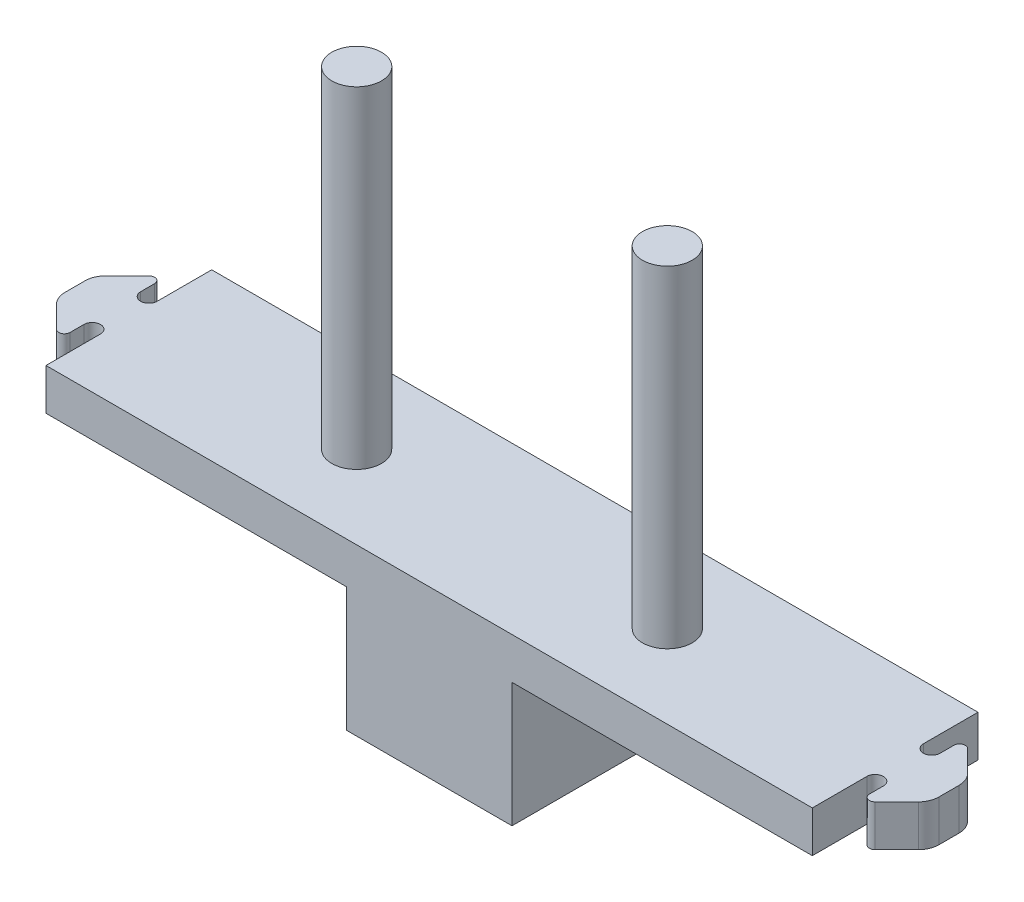
ISO-10303-21;
HEADER;
FILE_DESCRIPTION(('STEP AP214'),'2;1');
FILE_NAME('part.step','',(''),(''),'','','');
FILE_SCHEMA(('AUTOMOTIVE_DESIGN { 1 0 10303 214 1 1 1 1 }'));
ENDSEC;
DATA;
#1=APPLICATION_CONTEXT('core data for automotive mechanical design processes');
#2=APPLICATION_PROTOCOL_DEFINITION('international standard','automotive_design',2000,#1);
#3=PRODUCT_CONTEXT('',#1,'mechanical');
#4=PRODUCT('Part','Part','',(#3));
#5=PRODUCT_RELATED_PRODUCT_CATEGORY('part','',(#4));
#6=PRODUCT_DEFINITION_FORMATION('','',#4);
#7=PRODUCT_DEFINITION_CONTEXT('part definition',#1,'design');
#8=PRODUCT_DEFINITION('design','',#6,#7);
#9=PRODUCT_DEFINITION_SHAPE('','',#8);
#10=(LENGTH_UNIT() NAMED_UNIT(*) SI_UNIT(.MILLI.,.METRE.));
#11=(NAMED_UNIT(*) PLANE_ANGLE_UNIT() SI_UNIT($,.RADIAN.));
#12=(NAMED_UNIT(*) SI_UNIT($,.STERADIAN.) SOLID_ANGLE_UNIT());
#13=UNCERTAINTY_MEASURE_WITH_UNIT(LENGTH_MEASURE(1.E-05),#10,'distance_accuracy_value','');
#14=(GEOMETRIC_REPRESENTATION_CONTEXT(3) GLOBAL_UNCERTAINTY_ASSIGNED_CONTEXT((#13)) GLOBAL_UNIT_ASSIGNED_CONTEXT((#10,
#11,#12)) REPRESENTATION_CONTEXT('',''));
#15=CARTESIAN_POINT('',(0.,0.,0.));
#16=DIRECTION('',(0.,0.,1.));
#17=DIRECTION('',(1.,0.,0.));
#18=AXIS2_PLACEMENT_3D('',#15,#16,#17);
#19=CARTESIAN_POINT('',(0.,0.,0.));
#20=DIRECTION('',(0.,-1.,0.));
#21=DIRECTION('',(0.,0.,-1.));
#22=AXIS2_PLACEMENT_3D('',#19,#20,#21);
#23=PLANE('',#22);
#24=DIRECTION('',(-1.,0.,0.));
#25=VECTOR('',#24,1.);
#26=CARTESIAN_POINT('',(0.,0.,25.4));
#27=LINE('',#26,#25);
#28=CARTESIAN_POINT('',(0.,0.,25.4));
#29=VERTEX_POINT('',#28);
#30=CARTESIAN_POINT('',(-46.0375,0.,25.4));
#31=VERTEX_POINT('',#30);
#32=EDGE_CURVE('E563',#29,#31,#27,.T.);
#33=ORIENTED_EDGE('',*,*,#32,.T.);
#34=DIRECTION('',(0.,0.,-1.));
#35=VECTOR('',#34,1.);
#36=CARTESIAN_POINT('',(-46.0375,0.,25.4));
#37=LINE('',#36,#35);
#38=CARTESIAN_POINT('',(-46.0375,0.,0.));
#39=VERTEX_POINT('',#38);
#40=EDGE_CURVE('E282',#31,#39,#37,.T.);
#41=ORIENTED_EDGE('',*,*,#40,.T.);
#42=DIRECTION('',(-1.,0.,0.));
#43=VECTOR('',#42,1.);
#44=CARTESIAN_POINT('',(0.,0.,0.));
#45=LINE('',#44,#43);
#46=CARTESIAN_POINT('',(0.,0.,0.));
#47=VERTEX_POINT('',#46);
#48=EDGE_CURVE('E267',#47,#39,#45,.T.);
#49=ORIENTED_EDGE('',*,*,#48,.F.);
#50=DIRECTION('',(0.,0.,1.));
#51=VECTOR('',#50,1.);
#52=CARTESIAN_POINT('',(0.,0.,0.));
#53=LINE('',#52,#51);
#54=CARTESIAN_POINT('',(0.,0.,8.35659999999997));
#55=VERTEX_POINT('',#54);
#56=EDGE_CURVE('E558',#47,#55,#53,.T.);
#57=ORIENTED_EDGE('',*,*,#56,.T.);
#58=CARTESIAN_POINT('',(1.27000000000001,0.,8.35659999999997));
#59=DIRECTION('',(0.,-1.,0.));
#60=DIRECTION('',(0.,0.,1.));
#61=AXIS2_PLACEMENT_3D('',#58,#59,#60);
#62=CIRCLE('',#61,1.27000000000001);
#63=CARTESIAN_POINT('',(2.54000000000002,0.,8.35659999999997));
#64=VERTEX_POINT('',#63);
#65=EDGE_CURVE('E424',#64,#55,#62,.T.);
#66=ORIENTED_EDGE('',*,*,#65,.F.);
#67=DIRECTION('',(0.,0.,1.));
#68=VECTOR('',#67,1.);
#69=CARTESIAN_POINT('',(2.54000000000002,0.,8.35659999999997));
#70=LINE('',#69,#68);
#71=CARTESIAN_POINT('',(2.54000000000002,0.,6.22299999999997));
#72=VERTEX_POINT('',#71);
#73=EDGE_CURVE('E420',#72,#64,#70,.T.);
#74=ORIENTED_EDGE('',*,*,#73,.F.);
#75=CARTESIAN_POINT('',(3.40360000000002,0.,6.22299999999998));
#76=DIRECTION('',(0.,1.,0.));
#77=DIRECTION('',(0.,0.,-1.));
#78=AXIS2_PLACEMENT_3D('',#75,#76,#77);
#79=CIRCLE('',#78,0.863600000000003);
#80=CARTESIAN_POINT('',(4.01425741623272,0.,5.61234258376727));
#81=VERTEX_POINT('',#80);
#82=EDGE_CURVE('E416',#81,#72,#79,.T.);
#83=ORIENTED_EDGE('',*,*,#82,.F.);
#84=DIRECTION('',(-0.707106781186547,0.,-0.707106781186547));
#85=VECTOR('',#84,1.);
#86=CARTESIAN_POINT('',(4.01425741623272,0.,5.61234258376727));
#87=LINE('',#86,#85);
#88=CARTESIAN_POINT('',(7.33695218102832,0.,8.93503734856287));
#89=VERTEX_POINT('',#88);
#90=EDGE_CURVE('E412',#89,#81,#87,.T.);
#91=ORIENTED_EDGE('',*,*,#90,.F.);
#92=CARTESIAN_POINT('',(5.07627105699759,0.,11.1643748859159));
#93=DIRECTION('',(0.,1.,0.));
#94=DIRECTION('',(0.,0.,-1.));
#95=AXIS2_PLACEMENT_3D('',#92,#93,#94);
#96=CIRCLE('',#95,3.17500000000002);
#97=CARTESIAN_POINT('',(8.25119370011618,0.,11.1865381486048));
#98=VERTEX_POINT('',#97);
#99=EDGE_CURVE('E407',#98,#89,#96,.T.);
#100=ORIENTED_EDGE('',*,*,#99,.F.);
#101=DIRECTION('',(0.,0.,-1.));
#102=VECTOR('',#101,1.);
#103=CARTESIAN_POINT('',(8.25119370011618,0.,11.1865381486048));
#104=LINE('',#103,#102);
#105=CARTESIAN_POINT('',(8.25119370011618,0.,14.2134618513952));
#106=VERTEX_POINT('',#105);
#107=EDGE_CURVE('E403',#106,#98,#104,.T.);
#108=ORIENTED_EDGE('',*,*,#107,.F.);
#109=CARTESIAN_POINT('',(5.07627105699759,0.,14.2356251140841));
#110=DIRECTION('',(0.,-1.,0.));
#111=DIRECTION('',(0.,0.,1.));
#112=AXIS2_PLACEMENT_3D('',#109,#110,#111);
#113=CIRCLE('',#112,3.17500000000002);
#114=CARTESIAN_POINT('',(7.33695218102832,0.,16.4649626514371));
#115=VERTEX_POINT('',#114);
#116=EDGE_CURVE('E308',#106,#115,#113,.T.);
#117=ORIENTED_EDGE('',*,*,#116,.T.);
#118=DIRECTION('',(-0.707106781186547,0.,0.707106781186547));
#119=VECTOR('',#118,1.);
#120=CARTESIAN_POINT('',(4.01425741623272,0.,19.7876574162327));
#121=LINE('',#120,#119);
#122=CARTESIAN_POINT('',(4.01425741623272,0.,19.7876574162327));
#123=VERTEX_POINT('',#122);
#124=EDGE_CURVE('E305',#115,#123,#121,.T.);
#125=ORIENTED_EDGE('',*,*,#124,.T.);
#126=CARTESIAN_POINT('',(3.40360000000002,0.,19.177));
#127=DIRECTION('',(0.,-1.,0.));
#128=DIRECTION('',(0.,0.,1.));
#129=AXIS2_PLACEMENT_3D('',#126,#127,#128);
#130=CIRCLE('',#129,0.863600000000003);
#131=CARTESIAN_POINT('',(2.54000000000002,0.,19.177));
#132=VERTEX_POINT('',#131);
#133=EDGE_CURVE('E302',#123,#132,#130,.T.);
#134=ORIENTED_EDGE('',*,*,#133,.T.);
#135=DIRECTION('',(0.,0.,-1.));
#136=VECTOR('',#135,1.);
#137=CARTESIAN_POINT('',(2.54000000000002,0.,17.0434));
#138=LINE('',#137,#136);
#139=CARTESIAN_POINT('',(2.54000000000002,0.,17.0434));
#140=VERTEX_POINT('',#139);
#141=EDGE_CURVE('E298',#132,#140,#138,.T.);
#142=ORIENTED_EDGE('',*,*,#141,.T.);
#143=CARTESIAN_POINT('',(1.27000000000001,0.,17.0434));
#144=DIRECTION('',(0.,1.,0.));
#145=DIRECTION('',(0.,0.,-1.));
#146=AXIS2_PLACEMENT_3D('',#143,#144,#145);
#147=CIRCLE('',#146,1.27000000000001);
#148=CARTESIAN_POINT('',(0.,0.,17.0434));
#149=VERTEX_POINT('',#148);
#150=EDGE_CURVE('E294',#140,#149,#147,.T.);
#151=ORIENTED_EDGE('',*,*,#150,.T.);
#152=EDGE_CURVE('E539',#149,#29,#53,.T.);
#153=ORIENTED_EDGE('',*,*,#152,.T.);
#154=EDGE_LOOP('',(#33,#41,#49,#57,#66,#74,#83,#91,#100,#108,#117,#125,#134,#142,#151,#153));
#155=FACE_BOUND('',#154,.T.);
#156=ADVANCED_FACE('F39',(#155),#23,.T.);
#157=CARTESIAN_POINT('',(0.,6.35,0.));
#158=DIRECTION('',(1.,0.,0.));
#159=DIRECTION('',(0.,0.,-1.));
#160=AXIS2_PLACEMENT_3D('',#157,#158,#159);
#161=PLANE('',#160);
#162=ORIENTED_EDGE('',*,*,#152,.F.);
#163=DIRECTION('',(0.,1.,0.));
#164=VECTOR('',#163,1.);
#165=CARTESIAN_POINT('',(0.,0.,17.0434));
#166=LINE('',#165,#164);
#167=CARTESIAN_POINT('',(0.,6.35,17.0434));
#168=VERTEX_POINT('',#167);
#169=EDGE_CURVE('E63',#149,#168,#166,.T.);
#170=ORIENTED_EDGE('',*,*,#169,.T.);
#171=DIRECTION('',(0.,0.,1.));
#172=VECTOR('',#171,1.);
#173=CARTESIAN_POINT('',(0.,6.35,0.));
#174=LINE('',#173,#172);
#175=CARTESIAN_POINT('',(0.,6.35,25.4));
#176=VERTEX_POINT('',#175);
#177=EDGE_CURVE('E545',#168,#176,#174,.T.);
#178=ORIENTED_EDGE('',*,*,#177,.T.);
#179=DIRECTION('',(0.,-1.,0.));
#180=VECTOR('',#179,1.);
#181=CARTESIAN_POINT('',(0.,6.35,25.4));
#182=LINE('',#181,#180);
#183=EDGE_CURVE('E557',#176,#29,#182,.T.);
#184=ORIENTED_EDGE('',*,*,#183,.T.);
#185=EDGE_LOOP('',(#162,#170,#178,#184));
#186=FACE_BOUND('',#185,.T.);
#187=ADVANCED_FACE('F41',(#186),#161,.T.);
#188=CARTESIAN_POINT('',(-117.475,6.35,0.));
#189=DIRECTION('',(1.,0.,0.));
#190=DIRECTION('',(0.,0.,-1.));
#191=AXIS2_PLACEMENT_3D('',#188,#189,#190);
#192=PLANE('',#191);
#193=DIRECTION('',(0.,1.,0.));
#194=VECTOR('',#193,1.);
#195=CARTESIAN_POINT('',(-117.475,0.,17.0434));
#196=LINE('',#195,#194);
#197=CARTESIAN_POINT('',(-117.475,0.,17.0434));
#198=VERTEX_POINT('',#197);
#199=CARTESIAN_POINT('',(-117.475,6.35,17.0434));
#200=VERTEX_POINT('',#199);
#201=EDGE_CURVE('E380',#198,#200,#196,.T.);
#202=ORIENTED_EDGE('',*,*,#201,.F.);
#203=DIRECTION('',(0.,0.,1.));
#204=VECTOR('',#203,1.);
#205=CARTESIAN_POINT('',(-117.475,0.,0.));
#206=LINE('',#205,#204);
#207=CARTESIAN_POINT('',(-117.475,0.,25.4));
#208=VERTEX_POINT('',#207);
#209=EDGE_CURVE('E567',#198,#208,#206,.T.);
#210=ORIENTED_EDGE('',*,*,#209,.T.);
#211=DIRECTION('',(0.,-1.,0.));
#212=VECTOR('',#211,1.);
#213=CARTESIAN_POINT('',(-117.475,6.35,25.4));
#214=LINE('',#213,#212);
#215=CARTESIAN_POINT('',(-117.475,6.35,25.4));
#216=VERTEX_POINT('',#215);
#217=EDGE_CURVE('E581',#216,#208,#214,.T.);
#218=ORIENTED_EDGE('',*,*,#217,.F.);
#219=DIRECTION('',(0.,0.,1.));
#220=VECTOR('',#219,1.);
#221=CARTESIAN_POINT('',(-117.475,6.35,0.));
#222=LINE('',#221,#220);
#223=EDGE_CURVE('E549',#200,#216,#222,.T.);
#224=ORIENTED_EDGE('',*,*,#223,.F.);
#225=EDGE_LOOP('',(#202,#210,#218,#224));
#226=FACE_BOUND('',#225,.T.);
#227=ADVANCED_FACE('F613',(#226),#192,.F.);
#228=CARTESIAN_POINT('',(0.,6.35,0.));
#229=VERTEX_POINT('',#228);
#230=CARTESIAN_POINT('',(0.,6.35,8.35659999999997));
#231=VERTEX_POINT('',#230);
#232=EDGE_CURVE('E540',#229,#231,#174,.T.);
#233=ORIENTED_EDGE('',*,*,#232,.T.);
#234=DIRECTION('',(0.,1.,0.));
#235=VECTOR('',#234,1.);
#236=CARTESIAN_POINT('',(0.,0.,8.35659999999997));
#237=LINE('',#236,#235);
#238=EDGE_CURVE('E450',#55,#231,#237,.T.);
#239=ORIENTED_EDGE('',*,*,#238,.F.);
#240=ORIENTED_EDGE('',*,*,#56,.F.);
#241=DIRECTION('',(0.,-1.,0.));
#242=VECTOR('',#241,1.);
#243=CARTESIAN_POINT('',(0.,6.35,0.));
#244=LINE('',#243,#242);
#245=EDGE_CURVE('E574',#229,#47,#244,.T.);
#246=ORIENTED_EDGE('',*,*,#245,.F.);
#247=EDGE_LOOP('',(#233,#239,#240,#246));
#248=FACE_BOUND('',#247,.T.);
#249=ADVANCED_FACE('F614',(#248),#161,.T.);
#250=DIRECTION('',(0.,1.,0.));
#251=VECTOR('',#250,1.);
#252=CARTESIAN_POINT('',(-117.475,0.,8.35659999999997));
#253=LINE('',#252,#251);
#254=CARTESIAN_POINT('',(-117.475,0.,8.35659999999997));
#255=VERTEX_POINT('',#254);
#256=CARTESIAN_POINT('',(-117.475,6.35,8.35659999999997));
#257=VERTEX_POINT('',#256);
#258=EDGE_CURVE('E492',#255,#257,#253,.T.);
#259=ORIENTED_EDGE('',*,*,#258,.T.);
#260=CARTESIAN_POINT('',(-117.475,6.35,0.));
#261=VERTEX_POINT('',#260);
#262=EDGE_CURVE('E550',#261,#257,#222,.T.);
#263=ORIENTED_EDGE('',*,*,#262,.F.);
#264=DIRECTION('',(0.,-1.,0.));
#265=VECTOR('',#264,1.);
#266=CARTESIAN_POINT('',(-117.475,6.35,0.));
#267=LINE('',#266,#265);
#268=CARTESIAN_POINT('',(-117.475,0.,0.));
#269=VERTEX_POINT('',#268);
#270=EDGE_CURVE('E577',#261,#269,#267,.T.);
#271=ORIENTED_EDGE('',*,*,#270,.T.);
#272=EDGE_CURVE('E568',#269,#255,#206,.T.);
#273=ORIENTED_EDGE('',*,*,#272,.T.);
#274=EDGE_LOOP('',(#259,#263,#271,#273));
#275=FACE_BOUND('',#274,.T.);
#276=ADVANCED_FACE('F618',(#275),#192,.F.);
#277=CARTESIAN_POINT('',(0.,6.35,0.));
#278=DIRECTION('',(0.,0.,1.));
#279=DIRECTION('',(1.,0.,0.));
#280=AXIS2_PLACEMENT_3D('',#277,#278,#279);
#281=PLANE('',#280);
#282=ORIENTED_EDGE('',*,*,#48,.T.);
#283=DIRECTION('',(0.,1.,0.));
#284=VECTOR('',#283,1.);
#285=CARTESIAN_POINT('',(-46.0375,-19.05,0.));
#286=LINE('',#285,#284);
#287=CARTESIAN_POINT('',(-46.0375,-19.05,0.));
#288=VERTEX_POINT('',#287);
#289=EDGE_CURVE('E55',#288,#39,#286,.T.);
#290=ORIENTED_EDGE('',*,*,#289,.F.);
#291=DIRECTION('',(1.,0.,0.));
#292=VECTOR('',#291,1.);
#293=CARTESIAN_POINT('',(-71.4375,-19.05,0.));
#294=LINE('',#293,#292);
#295=CARTESIAN_POINT('',(-71.4375,-19.05,0.));
#296=VERTEX_POINT('',#295);
#297=EDGE_CURVE('E251',#296,#288,#294,.T.);
#298=ORIENTED_EDGE('',*,*,#297,.F.);
#299=DIRECTION('',(0.,1.,0.));
#300=VECTOR('',#299,1.);
#301=CARTESIAN_POINT('',(-71.4375,-19.05,0.));
#302=LINE('',#301,#300);
#303=CARTESIAN_POINT('',(-71.4375,0.,0.));
#304=VERTEX_POINT('',#303);
#305=EDGE_CURVE('E281',#296,#304,#302,.T.);
#306=ORIENTED_EDGE('',*,*,#305,.T.);
#307=EDGE_CURVE('E571',#304,#269,#45,.T.);
#308=ORIENTED_EDGE('',*,*,#307,.T.);
#309=ORIENTED_EDGE('',*,*,#270,.F.);
#310=DIRECTION('',(-1.,0.,0.));
#311=VECTOR('',#310,1.);
#312=CARTESIAN_POINT('',(0.,6.35,0.));
#313=LINE('',#312,#311);
#314=EDGE_CURVE('E554',#229,#261,#313,.T.);
#315=ORIENTED_EDGE('',*,*,#314,.F.);
#316=ORIENTED_EDGE('',*,*,#245,.T.);
#317=EDGE_LOOP('',(#282,#290,#298,#306,#308,#309,#315,#316));
#318=FACE_BOUND('',#317,.T.);
#319=ADVANCED_FACE('F265',(#318),#281,.F.);
#320=CARTESIAN_POINT('',(0.,6.35,25.4));
#321=DIRECTION('',(0.,0.,1.));
#322=DIRECTION('',(1.,0.,0.));
#323=AXIS2_PLACEMENT_3D('',#320,#321,#322);
#324=PLANE('',#323);
#325=ORIENTED_EDGE('',*,*,#32,.F.);
#326=ORIENTED_EDGE('',*,*,#183,.F.);
#327=DIRECTION('',(-1.,0.,0.));
#328=VECTOR('',#327,1.);
#329=CARTESIAN_POINT('',(0.,6.35,25.4));
#330=LINE('',#329,#328);
#331=EDGE_CURVE('E544',#176,#216,#330,.T.);
#332=ORIENTED_EDGE('',*,*,#331,.T.);
#333=ORIENTED_EDGE('',*,*,#217,.T.);
#334=CARTESIAN_POINT('',(-71.4375,0.,25.4));
#335=VERTEX_POINT('',#334);
#336=EDGE_CURVE('E562',#335,#208,#27,.T.);
#337=ORIENTED_EDGE('',*,*,#336,.F.);
#338=DIRECTION('',(0.,1.,0.));
#339=VECTOR('',#338,1.);
#340=CARTESIAN_POINT('',(-71.4375,-19.05,25.4));
#341=LINE('',#340,#339);
#342=CARTESIAN_POINT('',(-71.4375,-19.05,25.4));
#343=VERTEX_POINT('',#342);
#344=EDGE_CURVE('E289',#343,#335,#341,.T.);
#345=ORIENTED_EDGE('',*,*,#344,.F.);
#346=DIRECTION('',(1.,0.,0.));
#347=VECTOR('',#346,1.);
#348=CARTESIAN_POINT('',(-71.4375,-19.05,25.4));
#349=LINE('',#348,#347);
#350=CARTESIAN_POINT('',(-46.0375,-19.05,25.4));
#351=VERTEX_POINT('',#350);
#352=EDGE_CURVE('E274',#343,#351,#349,.T.);
#353=ORIENTED_EDGE('',*,*,#352,.T.);
#354=DIRECTION('',(0.,1.,0.));
#355=VECTOR('',#354,1.);
#356=CARTESIAN_POINT('',(-46.0375,-19.05,25.4));
#357=LINE('',#356,#355);
#358=EDGE_CURVE('E270',#351,#31,#357,.T.);
#359=ORIENTED_EDGE('',*,*,#358,.T.);
#360=EDGE_LOOP('',(#325,#326,#332,#333,#337,#345,#353,#359));
#361=FACE_BOUND('',#360,.T.);
#362=ADVANCED_FACE('F596',(#361),#324,.T.);
#363=CARTESIAN_POINT('',(0.,6.35,0.));
#364=DIRECTION('',(0.,-1.,0.));
#365=DIRECTION('',(0.,0.,-1.));
#366=AXIS2_PLACEMENT_3D('',#363,#364,#365);
#367=PLANE('',#366);
#368=ORIENTED_EDGE('',*,*,#177,.F.);
#369=CARTESIAN_POINT('',(1.27000000000001,6.35,17.0434));
#370=DIRECTION('',(0.,1.,0.));
#371=DIRECTION('',(0.,0.,-1.));
#372=AXIS2_PLACEMENT_3D('',#369,#370,#371);
#373=CIRCLE('',#372,1.27000000000001);
#374=CARTESIAN_POINT('',(2.54000000000002,6.35,17.0434));
#375=VERTEX_POINT('',#374);
#376=EDGE_CURVE('E269',#375,#168,#373,.T.);
#377=ORIENTED_EDGE('',*,*,#376,.F.);
#378=DIRECTION('',(0.,0.,-1.));
#379=VECTOR('',#378,1.);
#380=CARTESIAN_POINT('',(2.54000000000002,6.35,17.0434));
#381=LINE('',#380,#379);
#382=CARTESIAN_POINT('',(2.54000000000002,6.35,19.177));
#383=VERTEX_POINT('',#382);
#384=EDGE_CURVE('E314',#383,#375,#381,.T.);
#385=ORIENTED_EDGE('',*,*,#384,.F.);
#386=CARTESIAN_POINT('',(3.40360000000002,6.35,19.177));
#387=DIRECTION('',(0.,-1.,0.));
#388=DIRECTION('',(0.,0.,1.));
#389=AXIS2_PLACEMENT_3D('',#386,#387,#388);
#390=CIRCLE('',#389,0.863600000000003);
#391=CARTESIAN_POINT('',(4.01425741623272,6.35,19.7876574162327));
#392=VERTEX_POINT('',#391);
#393=EDGE_CURVE('E317',#392,#383,#390,.T.);
#394=ORIENTED_EDGE('',*,*,#393,.F.);
#395=DIRECTION('',(-0.707106781186547,0.,0.707106781186547));
#396=VECTOR('',#395,1.);
#397=CARTESIAN_POINT('',(4.01425741623272,6.35,19.7876574162327));
#398=LINE('',#397,#396);
#399=CARTESIAN_POINT('',(7.33695218102832,6.35,16.4649626514371));
#400=VERTEX_POINT('',#399);
#401=EDGE_CURVE('E320',#400,#392,#398,.T.);
#402=ORIENTED_EDGE('',*,*,#401,.F.);
#403=CARTESIAN_POINT('',(5.07627105699759,6.35,14.2356251140841));
#404=DIRECTION('',(0.,-1.,0.));
#405=DIRECTION('',(0.,0.,1.));
#406=AXIS2_PLACEMENT_3D('',#403,#404,#405);
#407=CIRCLE('',#406,3.17500000000002);
#408=CARTESIAN_POINT('',(8.25119370011618,6.35,14.2134618513952));
#409=VERTEX_POINT('',#408);
#410=EDGE_CURVE('E299',#409,#400,#407,.T.);
#411=ORIENTED_EDGE('',*,*,#410,.F.);
#412=DIRECTION('',(0.,0.,-1.));
#413=VECTOR('',#412,1.);
#414=CARTESIAN_POINT('',(8.25119370011618,6.35,11.1865381486048));
#415=LINE('',#414,#413);
#416=CARTESIAN_POINT('',(8.25119370011618,6.35,11.1865381486048));
#417=VERTEX_POINT('',#416);
#418=EDGE_CURVE('E383',#409,#417,#415,.T.);
#419=ORIENTED_EDGE('',*,*,#418,.T.);
#420=CARTESIAN_POINT('',(5.07627105699759,6.35,11.1643748859159));
#421=DIRECTION('',(0.,1.,0.));
#422=DIRECTION('',(0.,0.,-1.));
#423=AXIS2_PLACEMENT_3D('',#420,#421,#422);
#424=CIRCLE('',#423,3.17500000000002);
#425=CARTESIAN_POINT('',(7.33695218102832,6.35,8.93503734856287));
#426=VERTEX_POINT('',#425);
#427=EDGE_CURVE('E431',#417,#426,#424,.T.);
#428=ORIENTED_EDGE('',*,*,#427,.T.);
#429=DIRECTION('',(-0.707106781186547,0.,-0.707106781186547));
#430=VECTOR('',#429,1.);
#431=CARTESIAN_POINT('',(4.01425741623272,6.35,5.61234258376727));
#432=LINE('',#431,#430);
#433=CARTESIAN_POINT('',(4.01425741623272,6.35,5.61234258376727));
#434=VERTEX_POINT('',#433);
#435=EDGE_CURVE('E435',#426,#434,#432,.T.);
#436=ORIENTED_EDGE('',*,*,#435,.T.);
#437=CARTESIAN_POINT('',(3.40360000000002,6.35,6.22299999999998));
#438=DIRECTION('',(0.,1.,0.));
#439=DIRECTION('',(0.,0.,-1.));
#440=AXIS2_PLACEMENT_3D('',#437,#438,#439);
#441=CIRCLE('',#440,0.863600000000003);
#442=CARTESIAN_POINT('',(2.54000000000002,6.35,6.22299999999997));
#443=VERTEX_POINT('',#442);
#444=EDGE_CURVE('E439',#434,#443,#441,.T.);
#445=ORIENTED_EDGE('',*,*,#444,.T.);
#446=DIRECTION('',(0.,0.,1.));
#447=VECTOR('',#446,1.);
#448=CARTESIAN_POINT('',(2.54000000000002,6.35,8.35659999999997));
#449=LINE('',#448,#447);
#450=CARTESIAN_POINT('',(2.54000000000002,6.35,8.35659999999997));
#451=VERTEX_POINT('',#450);
#452=EDGE_CURVE('E443',#443,#451,#449,.T.);
#453=ORIENTED_EDGE('',*,*,#452,.T.);
#454=CARTESIAN_POINT('',(1.27000000000001,6.35,8.35659999999997));
#455=DIRECTION('',(0.,-1.,0.));
#456=DIRECTION('',(0.,0.,1.));
#457=AXIS2_PLACEMENT_3D('',#454,#455,#456);
#458=CIRCLE('',#457,1.27000000000001);
#459=EDGE_CURVE('E408',#451,#231,#458,.T.);
#460=ORIENTED_EDGE('',*,*,#459,.T.);
#461=ORIENTED_EDGE('',*,*,#232,.F.);
#462=ORIENTED_EDGE('',*,*,#314,.T.);
#463=ORIENTED_EDGE('',*,*,#262,.T.);
#464=CARTESIAN_POINT('',(-118.745,6.35,8.35659999999997));
#465=DIRECTION('',(0.,-1.,0.));
#466=DIRECTION('',(0.,0.,-1.));
#467=AXIS2_PLACEMENT_3D('',#464,#465,#466);
#468=CIRCLE('',#467,1.27000000000001);
#469=CARTESIAN_POINT('',(-120.015,6.35,8.35659999999997));
#470=VERTEX_POINT('',#469);
#471=EDGE_CURVE('E453',#257,#470,#468,.T.);
#472=ORIENTED_EDGE('',*,*,#471,.T.);
#473=DIRECTION('',(0.,0.,-1.));
#474=VECTOR('',#473,1.);
#475=CARTESIAN_POINT('',(-120.015,6.35,8.35659999999997));
#476=LINE('',#475,#474);
#477=CARTESIAN_POINT('',(-120.015,6.35,6.22299999999997));
#478=VERTEX_POINT('',#477);
#479=EDGE_CURVE('E496',#470,#478,#476,.T.);
#480=ORIENTED_EDGE('',*,*,#479,.T.);
#481=CARTESIAN_POINT('',(-120.8786,6.35,6.22299999999998));
#482=DIRECTION('',(0.,1.,0.));
#483=DIRECTION('',(0.,0.,1.));
#484=AXIS2_PLACEMENT_3D('',#481,#482,#483);
#485=CIRCLE('',#484,0.863600000000003);
#486=CARTESIAN_POINT('',(-121.489257416233,6.35,5.61234258376727));
#487=VERTEX_POINT('',#486);
#488=EDGE_CURVE('E500',#478,#487,#485,.T.);
#489=ORIENTED_EDGE('',*,*,#488,.T.);
#490=DIRECTION('',(-0.707106781186547,0.,0.707106781186548));
#491=VECTOR('',#490,1.);
#492=CARTESIAN_POINT('',(-121.489257416233,6.35,5.61234258376727));
#493=LINE('',#492,#491);
#494=CARTESIAN_POINT('',(-124.811952181028,6.35,8.93503734856287));
#495=VERTEX_POINT('',#494);
#496=EDGE_CURVE('E504',#487,#495,#493,.T.);
#497=ORIENTED_EDGE('',*,*,#496,.T.);
#498=CARTESIAN_POINT('',(-122.551271056998,6.35,11.1643748859159));
#499=DIRECTION('',(0.,1.,0.));
#500=DIRECTION('',(0.,0.,1.));
#501=AXIS2_PLACEMENT_3D('',#498,#499,#500);
#502=CIRCLE('',#501,3.17500000000002);
#503=CARTESIAN_POINT('',(-125.726193700116,6.35,11.1865381486048));
#504=VERTEX_POINT('',#503);
#505=EDGE_CURVE('E508',#495,#504,#502,.T.);
#506=ORIENTED_EDGE('',*,*,#505,.T.);
#507=DIRECTION('',(0.,0.,1.));
#508=VECTOR('',#507,1.);
#509=CARTESIAN_POINT('',(-125.726193700116,6.35,11.1865381486048));
#510=LINE('',#509,#508);
#511=CARTESIAN_POINT('',(-125.726193700116,6.35,14.2134618513952));
#512=VERTEX_POINT('',#511);
#513=EDGE_CURVE('E473',#504,#512,#510,.T.);
#514=ORIENTED_EDGE('',*,*,#513,.T.);
#515=CARTESIAN_POINT('',(-122.551271056998,6.35,14.2356251140841));
#516=DIRECTION('',(0.,-1.,0.));
#517=DIRECTION('',(0.,0.,-1.));
#518=AXIS2_PLACEMENT_3D('',#515,#516,#517);
#519=CIRCLE('',#518,3.17500000000002);
#520=CARTESIAN_POINT('',(-124.811952181028,6.35,16.4649626514371));
#521=VERTEX_POINT('',#520);
#522=EDGE_CURVE('E329',#521,#512,#519,.T.);
#523=ORIENTED_EDGE('',*,*,#522,.F.);
#524=DIRECTION('',(-0.707106781186547,0.,-0.707106781186548));
#525=VECTOR('',#524,1.);
#526=CARTESIAN_POINT('',(-121.489257416233,6.35,19.7876574162327));
#527=LINE('',#526,#525);
#528=CARTESIAN_POINT('',(-121.489257416233,6.35,19.7876574162327));
#529=VERTEX_POINT('',#528);
#530=EDGE_CURVE('E369',#529,#521,#527,.T.);
#531=ORIENTED_EDGE('',*,*,#530,.F.);
#532=CARTESIAN_POINT('',(-120.8786,6.35,19.177));
#533=DIRECTION('',(0.,-1.,0.));
#534=DIRECTION('',(0.,0.,-1.));
#535=AXIS2_PLACEMENT_3D('',#532,#533,#534);
#536=CIRCLE('',#535,0.863600000000003);
#537=CARTESIAN_POINT('',(-120.015,6.35,19.177));
#538=VERTEX_POINT('',#537);
#539=EDGE_CURVE('E372',#538,#529,#536,.T.);
#540=ORIENTED_EDGE('',*,*,#539,.F.);
#541=DIRECTION('',(0.,0.,1.));
#542=VECTOR('',#541,1.);
#543=CARTESIAN_POINT('',(-120.015,6.35,17.0434));
#544=LINE('',#543,#542);
#545=CARTESIAN_POINT('',(-120.015,6.35,17.0434));
#546=VERTEX_POINT('',#545);
#547=EDGE_CURVE('E375',#546,#538,#544,.T.);
#548=ORIENTED_EDGE('',*,*,#547,.F.);
#549=CARTESIAN_POINT('',(-118.745,6.35,17.0434));
#550=DIRECTION('',(0.,1.,0.));
#551=DIRECTION('',(0.,0.,1.));
#552=AXIS2_PLACEMENT_3D('',#549,#550,#551);
#553=CIRCLE('',#552,1.27000000000001);
#554=EDGE_CURVE('E353',#200,#546,#553,.T.);
#555=ORIENTED_EDGE('',*,*,#554,.F.);
#556=ORIENTED_EDGE('',*,*,#223,.T.);
#557=ORIENTED_EDGE('',*,*,#331,.F.);
#558=EDGE_LOOP('',(#368,#377,#385,#394,#402,#411,#419,#428,#436,#445,#453,#460,#461,#462,#463,
#472,#480,#489,#497,#506,#514,#523,#531,#540,#548,#555,#556,#557));
#559=FACE_BOUND('',#558,.T.);
#560=CARTESIAN_POINT('',(-82.55,6.35,12.7));
#561=DIRECTION('',(0.,-1.,0.));
#562=DIRECTION('',(0.,0.,-1.));
#563=AXIS2_PLACEMENT_3D('',#560,#561,#562);
#564=CIRCLE('',#563,3.81);
#565=CARTESIAN_POINT('',(-82.55,6.35,8.89));
#566=VERTEX_POINT('',#565);
#567=EDGE_CURVE('E11',#566,#566,#564,.F.);
#568=ORIENTED_EDGE('',*,*,#567,.F.);
#569=EDGE_LOOP('',(#568));
#570=FACE_BOUND('',#569,.T.);
#571=CARTESIAN_POINT('',(-34.925,6.35,12.7));
#572=DIRECTION('',(0.,-1.,0.));
#573=DIRECTION('',(0.,0.,-1.));
#574=AXIS2_PLACEMENT_3D('',#571,#572,#573);
#575=CIRCLE('',#574,3.81);
#576=CARTESIAN_POINT('',(-34.925,6.35,8.89));
#577=VERTEX_POINT('',#576);
#578=EDGE_CURVE('E48',#577,#577,#575,.F.);
#579=ORIENTED_EDGE('',*,*,#578,.F.);
#580=EDGE_LOOP('',(#579));
#581=FACE_BOUND('',#580,.T.);
#582=ADVANCED_FACE('F593',(#559,#570,#581),#367,.F.);
#583=DIRECTION('',(0.,0.,-1.));
#584=VECTOR('',#583,1.);
#585=CARTESIAN_POINT('',(-71.4375,0.,25.4));
#586=LINE('',#585,#584);
#587=EDGE_CURVE('E262',#335,#304,#586,.T.);
#588=ORIENTED_EDGE('',*,*,#587,.F.);
#589=ORIENTED_EDGE('',*,*,#336,.T.);
#590=ORIENTED_EDGE('',*,*,#209,.F.);
#591=CARTESIAN_POINT('',(-118.745,0.,17.0434));
#592=DIRECTION('',(0.,1.,0.));
#593=DIRECTION('',(0.,0.,1.));
#594=AXIS2_PLACEMENT_3D('',#591,#592,#593);
#595=CIRCLE('',#594,1.27000000000001);
#596=CARTESIAN_POINT('',(-120.015,0.,17.0434));
#597=VERTEX_POINT('',#596);
#598=EDGE_CURVE('E362',#198,#597,#595,.T.);
#599=ORIENTED_EDGE('',*,*,#598,.T.);
#600=DIRECTION('',(0.,0.,1.));
#601=VECTOR('',#600,1.);
#602=CARTESIAN_POINT('',(-120.015,0.,17.0434));
#603=LINE('',#602,#601);
#604=CARTESIAN_POINT('',(-120.015,0.,19.177));
#605=VERTEX_POINT('',#604);
#606=EDGE_CURVE('E359',#597,#605,#603,.T.);
#607=ORIENTED_EDGE('',*,*,#606,.T.);
#608=CARTESIAN_POINT('',(-120.8786,0.,19.177));
#609=DIRECTION('',(0.,-1.,0.));
#610=DIRECTION('',(0.,0.,-1.));
#611=AXIS2_PLACEMENT_3D('',#608,#609,#610);
#612=CIRCLE('',#611,0.863600000000003);
#613=CARTESIAN_POINT('',(-121.489257416233,0.,19.7876574162327));
#614=VERTEX_POINT('',#613);
#615=EDGE_CURVE('E356',#605,#614,#612,.T.);
#616=ORIENTED_EDGE('',*,*,#615,.T.);
#617=DIRECTION('',(-0.707106781186547,0.,-0.707106781186548));
#618=VECTOR('',#617,1.);
#619=CARTESIAN_POINT('',(-121.489257416233,0.,19.7876574162327));
#620=LINE('',#619,#618);
#621=CARTESIAN_POINT('',(-124.811952181028,0.,16.4649626514371));
#622=VERTEX_POINT('',#621);
#623=EDGE_CURVE('E352',#614,#622,#620,.T.);
#624=ORIENTED_EDGE('',*,*,#623,.T.);
#625=CARTESIAN_POINT('',(-122.551271056998,0.,14.2356251140841));
#626=DIRECTION('',(0.,-1.,0.));
#627=DIRECTION('',(0.,0.,-1.));
#628=AXIS2_PLACEMENT_3D('',#625,#626,#627);
#629=CIRCLE('',#628,3.17500000000002);
#630=CARTESIAN_POINT('',(-125.726193700116,0.,14.2134618513952));
#631=VERTEX_POINT('',#630);
#632=EDGE_CURVE('E348',#622,#631,#629,.T.);
#633=ORIENTED_EDGE('',*,*,#632,.T.);
#634=DIRECTION('',(0.,0.,1.));
#635=VECTOR('',#634,1.);
#636=CARTESIAN_POINT('',(-125.726193700116,0.,11.1865381486048));
#637=LINE('',#636,#635);
#638=CARTESIAN_POINT('',(-125.726193700116,0.,11.1865381486048));
#639=VERTEX_POINT('',#638);
#640=EDGE_CURVE('E489',#639,#631,#637,.T.);
#641=ORIENTED_EDGE('',*,*,#640,.F.);
#642=CARTESIAN_POINT('',(-122.551271056998,0.,11.1643748859159));
#643=DIRECTION('',(0.,1.,0.));
#644=DIRECTION('',(0.,0.,1.));
#645=AXIS2_PLACEMENT_3D('',#642,#643,#644);
#646=CIRCLE('',#645,3.17500000000002);
#647=CARTESIAN_POINT('',(-124.811952181028,0.,8.93503734856287));
#648=VERTEX_POINT('',#647);
#649=EDGE_CURVE('E485',#648,#639,#646,.T.);
#650=ORIENTED_EDGE('',*,*,#649,.F.);
#651=DIRECTION('',(-0.707106781186547,0.,0.707106781186548));
#652=VECTOR('',#651,1.);
#653=CARTESIAN_POINT('',(-121.489257416233,0.,5.61234258376727));
#654=LINE('',#653,#652);
#655=CARTESIAN_POINT('',(-121.489257416233,0.,5.61234258376727));
#656=VERTEX_POINT('',#655);
#657=EDGE_CURVE('E481',#656,#648,#654,.T.);
#658=ORIENTED_EDGE('',*,*,#657,.F.);
#659=CARTESIAN_POINT('',(-120.8786,0.,6.22299999999998));
#660=DIRECTION('',(0.,1.,0.));
#661=DIRECTION('',(0.,0.,1.));
#662=AXIS2_PLACEMENT_3D('',#659,#660,#661);
#663=CIRCLE('',#662,0.863600000000003);
#664=CARTESIAN_POINT('',(-120.015,0.,6.22299999999997));
#665=VERTEX_POINT('',#664);
#666=EDGE_CURVE('E477',#665,#656,#663,.T.);
#667=ORIENTED_EDGE('',*,*,#666,.F.);
#668=DIRECTION('',(0.,0.,-1.));
#669=VECTOR('',#668,1.);
#670=CARTESIAN_POINT('',(-120.015,0.,8.35659999999997));
#671=LINE('',#670,#669);
#672=CARTESIAN_POINT('',(-120.015,0.,8.35659999999997));
#673=VERTEX_POINT('',#672);
#674=EDGE_CURVE('E472',#673,#665,#671,.T.);
#675=ORIENTED_EDGE('',*,*,#674,.F.);
#676=CARTESIAN_POINT('',(-118.745,0.,8.35659999999997));
#677=DIRECTION('',(0.,-1.,0.));
#678=DIRECTION('',(0.,0.,-1.));
#679=AXIS2_PLACEMENT_3D('',#676,#677,#678);
#680=CIRCLE('',#679,1.27000000000001);
#681=EDGE_CURVE('E468',#255,#673,#680,.T.);
#682=ORIENTED_EDGE('',*,*,#681,.F.);
#683=ORIENTED_EDGE('',*,*,#272,.F.);
#684=ORIENTED_EDGE('',*,*,#307,.F.);
#685=EDGE_LOOP('',(#588,#589,#590,#599,#607,#616,#624,#633,#641,#650,#658,#667,#675,#682,#683,#684));
#686=FACE_BOUND('',#685,.T.);
#687=ADVANCED_FACE('F595',(#686),#23,.T.);
#688=CARTESIAN_POINT('',(-34.925,57.15,12.7));
#689=DIRECTION('',(0.,-1.,0.));
#690=DIRECTION('',(0.,0.,-1.));
#691=AXIS2_PLACEMENT_3D('',#688,#689,#690);
#692=CYLINDRICAL_SURFACE('',#691,3.81);
#693=CARTESIAN_POINT('',(-34.925,57.15,12.7));
#694=DIRECTION('',(0.,1.,0.));
#695=DIRECTION('',(0.,0.,1.));
#696=AXIS2_PLACEMENT_3D('',#693,#694,#695);
#697=CIRCLE('',#696,3.81);
#698=CARTESIAN_POINT('',(-34.925,57.15,16.51));
#699=VERTEX_POINT('',#698);
#700=EDGE_CURVE('E535',#699,#699,#697,.T.);
#701=ORIENTED_EDGE('',*,*,#700,.F.);
#702=EDGE_LOOP('',(#701));
#703=FACE_BOUND('',#702,.T.);
#704=ORIENTED_EDGE('',*,*,#578,.T.);
#705=EDGE_LOOP('',(#704));
#706=FACE_BOUND('',#705,.T.);
#707=ADVANCED_FACE('F591',(#703,#706),#692,.T.);
#708=CARTESIAN_POINT('',(-34.925,57.15,12.7));
#709=DIRECTION('',(0.,1.,0.));
#710=DIRECTION('',(0.,0.,1.));
#711=AXIS2_PLACEMENT_3D('',#708,#709,#710);
#712=PLANE('',#711);
#713=ORIENTED_EDGE('',*,*,#700,.T.);
#714=EDGE_LOOP('',(#713));
#715=FACE_BOUND('',#714,.T.);
#716=ADVANCED_FACE('F794',(#715),#712,.T.);
#717=CARTESIAN_POINT('',(-82.55,57.15,12.7));
#718=DIRECTION('',(0.,-1.,0.));
#719=DIRECTION('',(0.,0.,-1.));
#720=AXIS2_PLACEMENT_3D('',#717,#718,#719);
#721=CYLINDRICAL_SURFACE('',#720,3.81);
#722=CARTESIAN_POINT('',(-82.55,57.15,12.7));
#723=DIRECTION('',(0.,1.,0.));
#724=DIRECTION('',(0.,0.,1.));
#725=AXIS2_PLACEMENT_3D('',#722,#723,#724);
#726=CIRCLE('',#725,3.81);
#727=CARTESIAN_POINT('',(-82.55,57.15,16.51));
#728=VERTEX_POINT('',#727);
#729=EDGE_CURVE('E517',#728,#728,#726,.T.);
#730=ORIENTED_EDGE('',*,*,#729,.F.);
#731=EDGE_LOOP('',(#730));
#732=FACE_BOUND('',#731,.T.);
#733=ORIENTED_EDGE('',*,*,#567,.T.);
#734=EDGE_LOOP('',(#733));
#735=FACE_BOUND('',#734,.T.);
#736=ADVANCED_FACE('F791',(#732,#735),#721,.T.);
#737=CARTESIAN_POINT('',(-82.55,57.15,12.7));
#738=DIRECTION('',(0.,1.,0.));
#739=DIRECTION('',(0.,0.,1.));
#740=AXIS2_PLACEMENT_3D('',#737,#738,#739);
#741=PLANE('',#740);
#742=ORIENTED_EDGE('',*,*,#729,.T.);
#743=EDGE_LOOP('',(#742));
#744=FACE_BOUND('',#743,.T.);
#745=ADVANCED_FACE('F780',(#744),#741,.T.);
#746=CARTESIAN_POINT('',(-125.726193700116,0.,11.1865381486048));
#747=DIRECTION('',(-1.,0.,0.));
#748=DIRECTION('',(0.,0.,1.));
#749=AXIS2_PLACEMENT_3D('',#746,#747,#748);
#750=PLANE('',#749);
#751=ORIENTED_EDGE('',*,*,#513,.F.);
#752=DIRECTION('',(0.,1.,0.));
#753=VECTOR('',#752,1.);
#754=CARTESIAN_POINT('',(-125.726193700116,0.,11.1865381486048));
#755=LINE('',#754,#753);
#756=EDGE_CURVE('E514',#639,#504,#755,.T.);
#757=ORIENTED_EDGE('',*,*,#756,.F.);
#758=ORIENTED_EDGE('',*,*,#640,.T.);
#759=DIRECTION('',(0.,1.,0.));
#760=VECTOR('',#759,1.);
#761=CARTESIAN_POINT('',(-125.726193700116,0.,14.2134618513952));
#762=LINE('',#761,#760);
#763=EDGE_CURVE('E365',#631,#512,#762,.T.);
#764=ORIENTED_EDGE('',*,*,#763,.T.);
#765=EDGE_LOOP('',(#751,#757,#758,#764));
#766=FACE_BOUND('',#765,.T.);
#767=ADVANCED_FACE('F659',(#766),#750,.T.);
#768=CARTESIAN_POINT('',(-122.551271056998,0.,11.1643748859159));
#769=DIRECTION('',(0.,1.,0.));
#770=DIRECTION('',(0.,0.,1.));
#771=AXIS2_PLACEMENT_3D('',#768,#769,#770);
#772=CYLINDRICAL_SURFACE('',#771,3.17500000000002);
#773=ORIENTED_EDGE('',*,*,#505,.F.);
#774=DIRECTION('',(0.,1.,0.));
#775=VECTOR('',#774,1.);
#776=CARTESIAN_POINT('',(-124.811952181028,0.,8.93503734856287));
#777=LINE('',#776,#775);
#778=EDGE_CURVE('E518',#648,#495,#777,.T.);
#779=ORIENTED_EDGE('',*,*,#778,.F.);
#780=ORIENTED_EDGE('',*,*,#649,.T.);
#781=ORIENTED_EDGE('',*,*,#756,.T.);
#782=EDGE_LOOP('',(#773,#779,#780,#781));
#783=FACE_BOUND('',#782,.T.);
#784=ADVANCED_FACE('F655',(#783),#772,.T.);
#785=CARTESIAN_POINT('',(-121.489257416233,0.,5.61234258376727));
#786=DIRECTION('',(-0.707106781186548,0.,-0.707106781186547));
#787=DIRECTION('',(-0.707106781186547,0.,0.707106781186548));
#788=AXIS2_PLACEMENT_3D('',#785,#786,#787);
#789=PLANE('',#788);
#790=ORIENTED_EDGE('',*,*,#496,.F.);
#791=DIRECTION('',(0.,1.,0.));
#792=VECTOR('',#791,1.);
#793=CARTESIAN_POINT('',(-121.489257416233,0.,5.61234258376727));
#794=LINE('',#793,#792);
#795=EDGE_CURVE('E521',#656,#487,#794,.T.);
#796=ORIENTED_EDGE('',*,*,#795,.F.);
#797=ORIENTED_EDGE('',*,*,#657,.T.);
#798=ORIENTED_EDGE('',*,*,#778,.T.);
#799=EDGE_LOOP('',(#790,#796,#797,#798));
#800=FACE_BOUND('',#799,.T.);
#801=ADVANCED_FACE('F651',(#800),#789,.T.);
#802=CARTESIAN_POINT('',(-120.8786,0.,6.22299999999998));
#803=DIRECTION('',(0.,1.,0.));
#804=DIRECTION('',(0.,0.,1.));
#805=AXIS2_PLACEMENT_3D('',#802,#803,#804);
#806=CYLINDRICAL_SURFACE('',#805,0.863600000000003);
#807=ORIENTED_EDGE('',*,*,#488,.F.);
#808=DIRECTION('',(0.,1.,0.));
#809=VECTOR('',#808,1.);
#810=CARTESIAN_POINT('',(-120.015,0.,6.22299999999997));
#811=LINE('',#810,#809);
#812=EDGE_CURVE('E524',#665,#478,#811,.T.);
#813=ORIENTED_EDGE('',*,*,#812,.F.);
#814=ORIENTED_EDGE('',*,*,#666,.T.);
#815=ORIENTED_EDGE('',*,*,#795,.T.);
#816=EDGE_LOOP('',(#807,#813,#814,#815));
#817=FACE_BOUND('',#816,.T.);
#818=ADVANCED_FACE('F647',(#817),#806,.T.);
#819=CARTESIAN_POINT('',(-120.015,0.,8.35659999999997));
#820=DIRECTION('',(1.,0.,0.));
#821=DIRECTION('',(0.,0.,-1.));
#822=AXIS2_PLACEMENT_3D('',#819,#820,#821);
#823=PLANE('',#822);
#824=ORIENTED_EDGE('',*,*,#479,.F.);
#825=DIRECTION('',(0.,1.,0.));
#826=VECTOR('',#825,1.);
#827=CARTESIAN_POINT('',(-120.015,0.,8.35659999999997));
#828=LINE('',#827,#826);
#829=EDGE_CURVE('E527',#673,#470,#828,.T.);
#830=ORIENTED_EDGE('',*,*,#829,.F.);
#831=ORIENTED_EDGE('',*,*,#674,.T.);
#832=ORIENTED_EDGE('',*,*,#812,.T.);
#833=EDGE_LOOP('',(#824,#830,#831,#832));
#834=FACE_BOUND('',#833,.T.);
#835=ADVANCED_FACE('F643',(#834),#823,.T.);
#836=CARTESIAN_POINT('',(-118.745,0.,8.35659999999997));
#837=DIRECTION('',(0.,1.,0.));
#838=DIRECTION('',(0.,0.,1.));
#839=AXIS2_PLACEMENT_3D('',#836,#837,#838);
#840=CYLINDRICAL_SURFACE('',#839,1.27000000000001);
#841=ORIENTED_EDGE('',*,*,#471,.F.);
#842=ORIENTED_EDGE('',*,*,#258,.F.);
#843=ORIENTED_EDGE('',*,*,#681,.T.);
#844=ORIENTED_EDGE('',*,*,#829,.T.);
#845=EDGE_LOOP('',(#841,#842,#843,#844));
#846=FACE_BOUND('',#845,.T.);
#847=ADVANCED_FACE('F639',(#846),#840,.F.);
#848=CARTESIAN_POINT('',(1.27000000000001,0.,8.35659999999997));
#849=DIRECTION('',(0.,1.,0.));
#850=DIRECTION('',(0.,0.,1.));
#851=AXIS2_PLACEMENT_3D('',#848,#849,#850);
#852=CYLINDRICAL_SURFACE('',#851,1.27000000000001);
#853=ORIENTED_EDGE('',*,*,#459,.F.);
#854=DIRECTION('',(0.,1.,0.));
#855=VECTOR('',#854,1.);
#856=CARTESIAN_POINT('',(2.54000000000002,0.,8.35659999999997));
#857=LINE('',#856,#855);
#858=EDGE_CURVE('E454',#64,#451,#857,.T.);
#859=ORIENTED_EDGE('',*,*,#858,.F.);
#860=ORIENTED_EDGE('',*,*,#65,.T.);
#861=ORIENTED_EDGE('',*,*,#238,.T.);
#862=EDGE_LOOP('',(#853,#859,#860,#861));
#863=FACE_BOUND('',#862,.T.);
#864=ADVANCED_FACE('F702',(#863),#852,.F.);
#865=CARTESIAN_POINT('',(2.54000000000002,0.,8.35659999999997));
#866=DIRECTION('',(-1.,0.,0.));
#867=DIRECTION('',(0.,0.,1.));
#868=AXIS2_PLACEMENT_3D('',#865,#866,#867);
#869=PLANE('',#868);
#870=ORIENTED_EDGE('',*,*,#452,.F.);
#871=DIRECTION('',(0.,1.,0.));
#872=VECTOR('',#871,1.);
#873=CARTESIAN_POINT('',(2.54000000000002,0.,6.22299999999997));
#874=LINE('',#873,#872);
#875=EDGE_CURVE('E457',#72,#443,#874,.T.);
#876=ORIENTED_EDGE('',*,*,#875,.F.);
#877=ORIENTED_EDGE('',*,*,#73,.T.);
#878=ORIENTED_EDGE('',*,*,#858,.T.);
#879=EDGE_LOOP('',(#870,#876,#877,#878));
#880=FACE_BOUND('',#879,.T.);
#881=ADVANCED_FACE('F706',(#880),#869,.T.);
#882=CARTESIAN_POINT('',(3.40360000000002,0.,6.22299999999998));
#883=DIRECTION('',(0.,1.,0.));
#884=DIRECTION('',(0.,0.,1.));
#885=AXIS2_PLACEMENT_3D('',#882,#883,#884);
#886=CYLINDRICAL_SURFACE('',#885,0.863600000000003);
#887=ORIENTED_EDGE('',*,*,#444,.F.);
#888=DIRECTION('',(0.,1.,0.));
#889=VECTOR('',#888,1.);
#890=CARTESIAN_POINT('',(4.01425741623272,0.,5.61234258376727));
#891=LINE('',#890,#889);
#892=EDGE_CURVE('E460',#81,#434,#891,.T.);
#893=ORIENTED_EDGE('',*,*,#892,.F.);
#894=ORIENTED_EDGE('',*,*,#82,.T.);
#895=ORIENTED_EDGE('',*,*,#875,.T.);
#896=EDGE_LOOP('',(#887,#893,#894,#895));
#897=FACE_BOUND('',#896,.T.);
#898=ADVANCED_FACE('F711',(#897),#886,.T.);
#899=CARTESIAN_POINT('',(4.01425741623272,0.,5.61234258376727));
#900=DIRECTION('',(0.707106781186548,0.,-0.707106781186548));
#901=DIRECTION('',(-0.707106781186548,0.,-0.707106781186547));
#902=AXIS2_PLACEMENT_3D('',#899,#900,#901);
#903=PLANE('',#902);
#904=ORIENTED_EDGE('',*,*,#435,.F.);
#905=DIRECTION('',(0.,1.,0.));
#906=VECTOR('',#905,1.);
#907=CARTESIAN_POINT('',(7.33695218102832,0.,8.93503734856287));
#908=LINE('',#907,#906);
#909=EDGE_CURVE('E463',#89,#426,#908,.T.);
#910=ORIENTED_EDGE('',*,*,#909,.F.);
#911=ORIENTED_EDGE('',*,*,#90,.T.);
#912=ORIENTED_EDGE('',*,*,#892,.T.);
#913=EDGE_LOOP('',(#904,#910,#911,#912));
#914=FACE_BOUND('',#913,.T.);
#915=ADVANCED_FACE('F714',(#914),#903,.T.);
#916=CARTESIAN_POINT('',(5.07627105699759,0.,11.1643748859159));
#917=DIRECTION('',(0.,1.,0.));
#918=DIRECTION('',(0.,0.,1.));
#919=AXIS2_PLACEMENT_3D('',#916,#917,#918);
#920=CYLINDRICAL_SURFACE('',#919,3.17500000000002);
#921=ORIENTED_EDGE('',*,*,#427,.F.);
#922=DIRECTION('',(0.,1.,0.));
#923=VECTOR('',#922,1.);
#924=CARTESIAN_POINT('',(8.25119370011618,0.,11.1865381486048));
#925=LINE('',#924,#923);
#926=EDGE_CURVE('E427',#98,#417,#925,.T.);
#927=ORIENTED_EDGE('',*,*,#926,.F.);
#928=ORIENTED_EDGE('',*,*,#99,.T.);
#929=ORIENTED_EDGE('',*,*,#909,.T.);
#930=EDGE_LOOP('',(#921,#927,#928,#929));
#931=FACE_BOUND('',#930,.T.);
#932=ADVANCED_FACE('F718',(#931),#920,.T.);
#933=CARTESIAN_POINT('',(8.25119370011618,0.,11.1865381486048));
#934=DIRECTION('',(1.,0.,0.));
#935=DIRECTION('',(0.,0.,-1.));
#936=AXIS2_PLACEMENT_3D('',#933,#934,#935);
#937=PLANE('',#936);
#938=ORIENTED_EDGE('',*,*,#418,.F.);
#939=DIRECTION('',(0.,1.,0.));
#940=VECTOR('',#939,1.);
#941=CARTESIAN_POINT('',(8.25119370011618,0.,14.2134618513952));
#942=LINE('',#941,#940);
#943=EDGE_CURVE('E325',#106,#409,#942,.T.);
#944=ORIENTED_EDGE('',*,*,#943,.F.);
#945=ORIENTED_EDGE('',*,*,#107,.T.);
#946=ORIENTED_EDGE('',*,*,#926,.T.);
#947=EDGE_LOOP('',(#938,#944,#945,#946));
#948=FACE_BOUND('',#947,.T.);
#949=ADVANCED_FACE('F720',(#948),#937,.T.);
#950=CARTESIAN_POINT('',(-118.745,0.,17.0434));
#951=DIRECTION('',(0.,1.,0.));
#952=DIRECTION('',(0.,0.,1.));
#953=AXIS2_PLACEMENT_3D('',#950,#951,#952);
#954=CYLINDRICAL_SURFACE('',#953,1.27000000000001);
#955=ORIENTED_EDGE('',*,*,#554,.T.);
#956=DIRECTION('',(0.,1.,0.));
#957=VECTOR('',#956,1.);
#958=CARTESIAN_POINT('',(-120.015,0.,17.0434));
#959=LINE('',#958,#957);
#960=EDGE_CURVE('E384',#597,#546,#959,.T.);
#961=ORIENTED_EDGE('',*,*,#960,.F.);
#962=ORIENTED_EDGE('',*,*,#598,.F.);
#963=ORIENTED_EDGE('',*,*,#201,.T.);
#964=EDGE_LOOP('',(#955,#961,#962,#963));
#965=FACE_BOUND('',#964,.T.);
#966=ADVANCED_FACE('F750',(#965),#954,.F.);
#967=CARTESIAN_POINT('',(-120.015,0.,17.0434));
#968=DIRECTION('',(-1.,0.,0.));
#969=DIRECTION('',(0.,0.,1.));
#970=AXIS2_PLACEMENT_3D('',#967,#968,#969);
#971=PLANE('',#970);
#972=ORIENTED_EDGE('',*,*,#547,.T.);
#973=DIRECTION('',(0.,1.,0.));
#974=VECTOR('',#973,1.);
#975=CARTESIAN_POINT('',(-120.015,0.,19.177));
#976=LINE('',#975,#974);
#977=EDGE_CURVE('E388',#605,#538,#976,.T.);
#978=ORIENTED_EDGE('',*,*,#977,.F.);
#979=ORIENTED_EDGE('',*,*,#606,.F.);
#980=ORIENTED_EDGE('',*,*,#960,.T.);
#981=EDGE_LOOP('',(#972,#978,#979,#980));
#982=FACE_BOUND('',#981,.T.);
#983=ADVANCED_FACE('F679',(#982),#971,.F.);
#984=CARTESIAN_POINT('',(-120.8786,0.,19.177));
#985=DIRECTION('',(0.,1.,0.));
#986=DIRECTION('',(0.,0.,1.));
#987=AXIS2_PLACEMENT_3D('',#984,#985,#986);
#988=CYLINDRICAL_SURFACE('',#987,0.863600000000003);
#989=ORIENTED_EDGE('',*,*,#539,.T.);
#990=DIRECTION('',(0.,1.,0.));
#991=VECTOR('',#990,1.);
#992=CARTESIAN_POINT('',(-121.489257416233,0.,19.7876574162327));
#993=LINE('',#992,#991);
#994=EDGE_CURVE('E392',#614,#529,#993,.T.);
#995=ORIENTED_EDGE('',*,*,#994,.F.);
#996=ORIENTED_EDGE('',*,*,#615,.F.);
#997=ORIENTED_EDGE('',*,*,#977,.T.);
#998=EDGE_LOOP('',(#989,#995,#996,#997));
#999=FACE_BOUND('',#998,.T.);
#1000=ADVANCED_FACE('F675',(#999),#988,.T.);
#1001=CARTESIAN_POINT('',(-121.489257416233,0.,19.7876574162327));
#1002=DIRECTION('',(0.707106781186548,0.,-0.707106781186547));
#1003=DIRECTION('',(-0.707106781186547,0.,-0.707106781186548));
#1004=AXIS2_PLACEMENT_3D('',#1001,#1002,#1003);
#1005=PLANE('',#1004);
#1006=ORIENTED_EDGE('',*,*,#530,.T.);
#1007=DIRECTION('',(0.,1.,0.));
#1008=VECTOR('',#1007,1.);
#1009=CARTESIAN_POINT('',(-124.811952181028,0.,16.4649626514371));
#1010=LINE('',#1009,#1008);
#1011=EDGE_CURVE('E396',#622,#521,#1010,.T.);
#1012=ORIENTED_EDGE('',*,*,#1011,.F.);
#1013=ORIENTED_EDGE('',*,*,#623,.F.);
#1014=ORIENTED_EDGE('',*,*,#994,.T.);
#1015=EDGE_LOOP('',(#1006,#1012,#1013,#1014));
#1016=FACE_BOUND('',#1015,.T.);
#1017=ADVANCED_FACE('F670',(#1016),#1005,.F.);
#1018=CARTESIAN_POINT('',(-122.551271056998,0.,14.2356251140841));
#1019=DIRECTION('',(0.,1.,0.));
#1020=DIRECTION('',(0.,0.,1.));
#1021=AXIS2_PLACEMENT_3D('',#1018,#1019,#1020);
#1022=CYLINDRICAL_SURFACE('',#1021,3.17500000000002);
#1023=ORIENTED_EDGE('',*,*,#522,.T.);
#1024=ORIENTED_EDGE('',*,*,#763,.F.);
#1025=ORIENTED_EDGE('',*,*,#632,.F.);
#1026=ORIENTED_EDGE('',*,*,#1011,.T.);
#1027=EDGE_LOOP('',(#1023,#1024,#1025,#1026));
#1028=FACE_BOUND('',#1027,.T.);
#1029=ADVANCED_FACE('F664',(#1028),#1022,.T.);
#1030=CARTESIAN_POINT('',(5.07627105699759,0.,14.2356251140841));
#1031=DIRECTION('',(0.,1.,0.));
#1032=DIRECTION('',(0.,0.,1.));
#1033=AXIS2_PLACEMENT_3D('',#1030,#1031,#1032);
#1034=CYLINDRICAL_SURFACE('',#1033,3.17500000000002);
#1035=ORIENTED_EDGE('',*,*,#410,.T.);
#1036=DIRECTION('',(0.,1.,0.));
#1037=VECTOR('',#1036,1.);
#1038=CARTESIAN_POINT('',(7.33695218102832,0.,16.4649626514371));
#1039=LINE('',#1038,#1037);
#1040=EDGE_CURVE('E330',#115,#400,#1039,.T.);
#1041=ORIENTED_EDGE('',*,*,#1040,.F.);
#1042=ORIENTED_EDGE('',*,*,#116,.F.);
#1043=ORIENTED_EDGE('',*,*,#943,.T.);
#1044=EDGE_LOOP('',(#1035,#1041,#1042,#1043));
#1045=FACE_BOUND('',#1044,.T.);
#1046=ADVANCED_FACE('F727',(#1045),#1034,.T.);
#1047=CARTESIAN_POINT('',(4.01425741623272,0.,19.7876574162327));
#1048=DIRECTION('',(-0.707106781186548,0.,-0.707106781186548));
#1049=DIRECTION('',(-0.707106781186548,0.,0.707106781186547));
#1050=AXIS2_PLACEMENT_3D('',#1047,#1048,#1049);
#1051=PLANE('',#1050);
#1052=ORIENTED_EDGE('',*,*,#401,.T.);
#1053=DIRECTION('',(0.,1.,0.));
#1054=VECTOR('',#1053,1.);
#1055=CARTESIAN_POINT('',(4.01425741623272,0.,19.7876574162327));
#1056=LINE('',#1055,#1054);
#1057=EDGE_CURVE('E334',#123,#392,#1056,.T.);
#1058=ORIENTED_EDGE('',*,*,#1057,.F.);
#1059=ORIENTED_EDGE('',*,*,#124,.F.);
#1060=ORIENTED_EDGE('',*,*,#1040,.T.);
#1061=EDGE_LOOP('',(#1052,#1058,#1059,#1060));
#1062=FACE_BOUND('',#1061,.T.);
#1063=ADVANCED_FACE('F731',(#1062),#1051,.F.);
#1064=CARTESIAN_POINT('',(3.40360000000002,0.,19.177));
#1065=DIRECTION('',(0.,1.,0.));
#1066=DIRECTION('',(0.,0.,1.));
#1067=AXIS2_PLACEMENT_3D('',#1064,#1065,#1066);
#1068=CYLINDRICAL_SURFACE('',#1067,0.863600000000003);
#1069=ORIENTED_EDGE('',*,*,#393,.T.);
#1070=DIRECTION('',(0.,1.,0.));
#1071=VECTOR('',#1070,1.);
#1072=CARTESIAN_POINT('',(2.54000000000002,0.,19.177));
#1073=LINE('',#1072,#1071);
#1074=EDGE_CURVE('E338',#132,#383,#1073,.T.);
#1075=ORIENTED_EDGE('',*,*,#1074,.F.);
#1076=ORIENTED_EDGE('',*,*,#133,.F.);
#1077=ORIENTED_EDGE('',*,*,#1057,.T.);
#1078=EDGE_LOOP('',(#1069,#1075,#1076,#1077));
#1079=FACE_BOUND('',#1078,.T.);
#1080=ADVANCED_FACE('F736',(#1079),#1068,.T.);
#1081=CARTESIAN_POINT('',(2.54000000000002,0.,17.0434));
#1082=DIRECTION('',(1.,0.,0.));
#1083=DIRECTION('',(0.,0.,-1.));
#1084=AXIS2_PLACEMENT_3D('',#1081,#1082,#1083);
#1085=PLANE('',#1084);
#1086=ORIENTED_EDGE('',*,*,#384,.T.);
#1087=DIRECTION('',(0.,1.,0.));
#1088=VECTOR('',#1087,1.);
#1089=CARTESIAN_POINT('',(2.54000000000002,0.,17.0434));
#1090=LINE('',#1089,#1088);
#1091=EDGE_CURVE('E342',#140,#375,#1090,.T.);
#1092=ORIENTED_EDGE('',*,*,#1091,.F.);
#1093=ORIENTED_EDGE('',*,*,#141,.F.);
#1094=ORIENTED_EDGE('',*,*,#1074,.T.);
#1095=EDGE_LOOP('',(#1086,#1092,#1093,#1094));
#1096=FACE_BOUND('',#1095,.T.);
#1097=ADVANCED_FACE('F740',(#1096),#1085,.F.);
#1098=CARTESIAN_POINT('',(1.27000000000001,0.,17.0434));
#1099=DIRECTION('',(0.,1.,0.));
#1100=DIRECTION('',(0.,0.,1.));
#1101=AXIS2_PLACEMENT_3D('',#1098,#1099,#1100);
#1102=CYLINDRICAL_SURFACE('',#1101,1.27000000000001);
#1103=ORIENTED_EDGE('',*,*,#376,.T.);
#1104=ORIENTED_EDGE('',*,*,#169,.F.);
#1105=ORIENTED_EDGE('',*,*,#150,.F.);
#1106=ORIENTED_EDGE('',*,*,#1091,.T.);
#1107=EDGE_LOOP('',(#1103,#1104,#1105,#1106));
#1108=FACE_BOUND('',#1107,.T.);
#1109=ADVANCED_FACE('F744',(#1108),#1102,.F.);
#1110=CARTESIAN_POINT('',(-46.0375,-19.05,25.4));
#1111=DIRECTION('',(1.,0.,0.));
#1112=DIRECTION('',(0.,0.,-1.));
#1113=AXIS2_PLACEMENT_3D('',#1110,#1111,#1112);
#1114=PLANE('',#1113);
#1115=ORIENTED_EDGE('',*,*,#40,.F.);
#1116=ORIENTED_EDGE('',*,*,#358,.F.);
#1117=DIRECTION('',(0.,0.,-1.));
#1118=VECTOR('',#1117,1.);
#1119=CARTESIAN_POINT('',(-46.0375,-19.05,25.4));
#1120=LINE('',#1119,#1118);
#1121=EDGE_CURVE('E254',#351,#288,#1120,.T.);
#1122=ORIENTED_EDGE('',*,*,#1121,.T.);
#1123=ORIENTED_EDGE('',*,*,#289,.T.);
#1124=EDGE_LOOP('',(#1115,#1116,#1122,#1123));
#1125=FACE_BOUND('',#1124,.T.);
#1126=ADVANCED_FACE('F272',(#1125),#1114,.T.);
#1127=CARTESIAN_POINT('',(-71.4375,-19.05,25.4));
#1128=DIRECTION('',(1.,0.,0.));
#1129=DIRECTION('',(0.,0.,-1.));
#1130=AXIS2_PLACEMENT_3D('',#1127,#1128,#1129);
#1131=PLANE('',#1130);
#1132=ORIENTED_EDGE('',*,*,#587,.T.);
#1133=ORIENTED_EDGE('',*,*,#305,.F.);
#1134=DIRECTION('',(0.,0.,-1.));
#1135=VECTOR('',#1134,1.);
#1136=CARTESIAN_POINT('',(-71.4375,-19.05,25.4));
#1137=LINE('',#1136,#1135);
#1138=EDGE_CURVE('E257',#343,#296,#1137,.T.);
#1139=ORIENTED_EDGE('',*,*,#1138,.F.);
#1140=ORIENTED_EDGE('',*,*,#344,.T.);
#1141=EDGE_LOOP('',(#1132,#1133,#1139,#1140));
#1142=FACE_BOUND('',#1141,.T.);
#1143=ADVANCED_FACE('F749',(#1142),#1131,.F.);
#1144=CARTESIAN_POINT('',(0.,-19.05,0.));
#1145=DIRECTION('',(0.,1.,0.));
#1146=DIRECTION('',(0.,0.,1.));
#1147=AXIS2_PLACEMENT_3D('',#1144,#1145,#1146);
#1148=PLANE('',#1147);
#1149=ORIENTED_EDGE('',*,*,#297,.T.);
#1150=ORIENTED_EDGE('',*,*,#1121,.F.);
#1151=ORIENTED_EDGE('',*,*,#352,.F.);
#1152=ORIENTED_EDGE('',*,*,#1138,.T.);
#1153=EDGE_LOOP('',(#1149,#1150,#1151,#1152));
#1154=FACE_BOUND('',#1153,.T.);
#1155=ADVANCED_FACE('F252',(#1154),#1148,.F.);
#1156=CLOSED_SHELL('',(#156,#187,#227,#249,#276,#319,#362,#582,#687,#707,#716,#736,#745,#767,
#784,#801,#818,#835,#847,#864,#881,#898,#915,#932,#949,#966,#983,#1000,#1017,#1029,#1046,#1063,
#1080,#1097,#1109,#1126,#1143,#1155));
#1157=MANIFOLD_SOLID_BREP('B2',#1156);
#1158=ADVANCED_BREP_SHAPE_REPRESENTATION('',(#18,#1157),#14);
#1159=SHAPE_DEFINITION_REPRESENTATION(#9,#1158);
ENDSEC;
END-ISO-10303-21;
